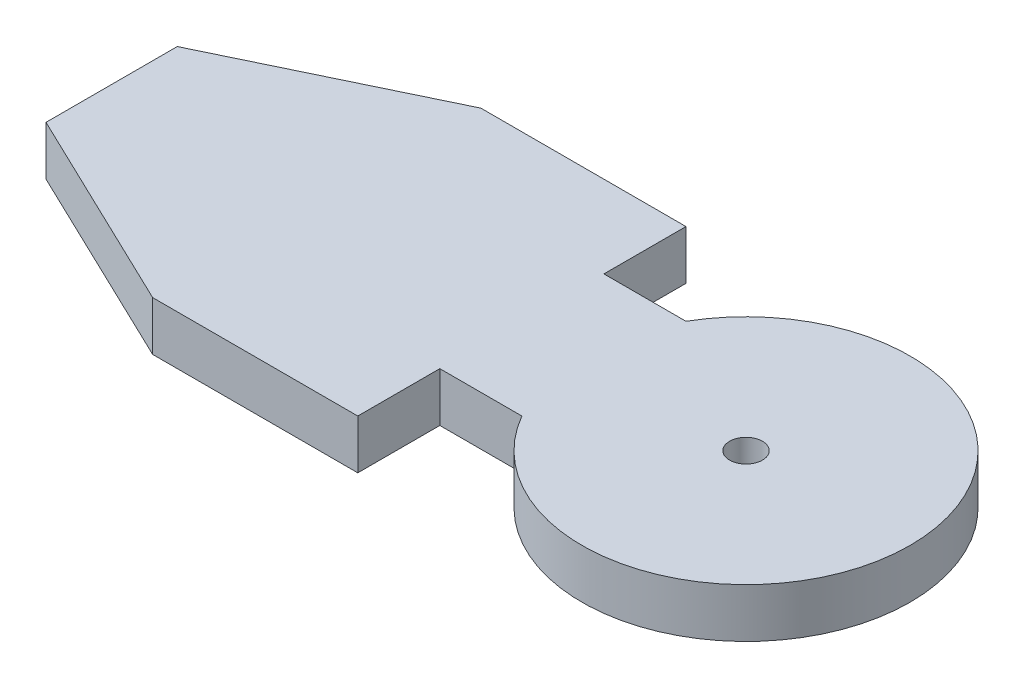
ISO-10303-21;
HEADER;
FILE_DESCRIPTION(('STEP AP214'),'2;1');
FILE_NAME('part.step','',(''),(''),'','','');
FILE_SCHEMA(('AUTOMOTIVE_DESIGN { 1 0 10303 214 1 1 1 1 }'));
ENDSEC;
DATA;
#1=APPLICATION_CONTEXT('core data for automotive mechanical design processes');
#2=APPLICATION_PROTOCOL_DEFINITION('international standard','automotive_design',2000,#1);
#3=PRODUCT_CONTEXT('',#1,'mechanical');
#4=PRODUCT('Part','Part','',(#3));
#5=PRODUCT_RELATED_PRODUCT_CATEGORY('part','',(#4));
#6=PRODUCT_DEFINITION_FORMATION('','',#4);
#7=PRODUCT_DEFINITION_CONTEXT('part definition',#1,'design');
#8=PRODUCT_DEFINITION('design','',#6,#7);
#9=PRODUCT_DEFINITION_SHAPE('','',#8);
#10=(LENGTH_UNIT() NAMED_UNIT(*) SI_UNIT(.MILLI.,.METRE.));
#11=(NAMED_UNIT(*) PLANE_ANGLE_UNIT() SI_UNIT($,.RADIAN.));
#12=(NAMED_UNIT(*) SI_UNIT($,.STERADIAN.) SOLID_ANGLE_UNIT());
#13=UNCERTAINTY_MEASURE_WITH_UNIT(LENGTH_MEASURE(1.E-05),#10,'distance_accuracy_value','');
#14=(GEOMETRIC_REPRESENTATION_CONTEXT(3) GLOBAL_UNCERTAINTY_ASSIGNED_CONTEXT((#13)) GLOBAL_UNIT_ASSIGNED_CONTEXT((#10,
#11,#12)) REPRESENTATION_CONTEXT('',''));
#15=CARTESIAN_POINT('',(0.,0.,0.));
#16=DIRECTION('',(0.,0.,1.));
#17=DIRECTION('',(1.,0.,0.));
#18=AXIS2_PLACEMENT_3D('',#15,#16,#17);
#19=CARTESIAN_POINT('',(0.,3.,0.));
#20=DIRECTION('',(-1.,0.,0.));
#21=DIRECTION('',(0.,0.,1.));
#22=AXIS2_PLACEMENT_3D('',#19,#20,#21);
#23=PLANE('',#22);
#24=DIRECTION('',(0.,0.,-1.));
#25=VECTOR('',#24,1.);
#26=CARTESIAN_POINT('',(0.,0.,0.));
#27=LINE('',#26,#25);
#28=CARTESIAN_POINT('',(0.,0.,0.));
#29=VERTEX_POINT('',#28);
#30=CARTESIAN_POINT('',(0.,0.,-5.));
#31=VERTEX_POINT('',#30);
#32=EDGE_CURVE('E142',#29,#31,#27,.T.);
#33=ORIENTED_EDGE('',*,*,#32,.T.);
#34=DIRECTION('',(0.,-1.,0.));
#35=VECTOR('',#34,1.);
#36=CARTESIAN_POINT('',(0.,3.,-5.));
#37=LINE('',#36,#35);
#38=CARTESIAN_POINT('',(0.,3.,-5.));
#39=VERTEX_POINT('',#38);
#40=EDGE_CURVE('E11',#39,#31,#37,.T.);
#41=ORIENTED_EDGE('',*,*,#40,.F.);
#42=DIRECTION('',(0.,0.,-1.));
#43=VECTOR('',#42,1.);
#44=CARTESIAN_POINT('',(0.,3.,0.));
#45=LINE('',#44,#43);
#46=CARTESIAN_POINT('',(0.,3.,0.));
#47=VERTEX_POINT('',#46);
#48=EDGE_CURVE('E160',#47,#39,#45,.T.);
#49=ORIENTED_EDGE('',*,*,#48,.F.);
#50=DIRECTION('',(0.,-1.,0.));
#51=VECTOR('',#50,1.);
#52=CARTESIAN_POINT('',(0.,3.,0.));
#53=LINE('',#52,#51);
#54=EDGE_CURVE('E138',#47,#29,#53,.T.);
#55=ORIENTED_EDGE('',*,*,#54,.T.);
#56=EDGE_LOOP('',(#33,#41,#49,#55));
#57=FACE_BOUND('',#56,.T.);
#58=ADVANCED_FACE('F33',(#57),#23,.F.);
#59=CARTESIAN_POINT('',(0.,3.,-5.));
#60=DIRECTION('',(0.,0.,-1.));
#61=DIRECTION('',(-1.,0.,0.));
#62=AXIS2_PLACEMENT_3D('',#59,#60,#61);
#63=PLANE('',#62);
#64=DIRECTION('',(1.,0.,0.));
#65=VECTOR('',#64,1.);
#66=CARTESIAN_POINT('',(0.,0.,-5.));
#67=LINE('',#66,#65);
#68=CARTESIAN_POINT('',(5.,0.,-5.));
#69=VERTEX_POINT('',#68);
#70=EDGE_CURVE('E145',#31,#69,#67,.T.);
#71=ORIENTED_EDGE('',*,*,#70,.T.);
#72=DIRECTION('',(0.,-1.,0.));
#73=VECTOR('',#72,1.);
#74=CARTESIAN_POINT('',(5.,3.,-5.));
#75=LINE('',#74,#73);
#76=CARTESIAN_POINT('',(5.,3.,-5.));
#77=VERTEX_POINT('',#76);
#78=EDGE_CURVE('E42',#77,#69,#75,.T.);
#79=ORIENTED_EDGE('',*,*,#78,.F.);
#80=DIRECTION('',(1.,0.,0.));
#81=VECTOR('',#80,1.);
#82=CARTESIAN_POINT('',(0.,3.,-5.));
#83=LINE('',#82,#81);
#84=EDGE_CURVE('E99',#39,#77,#83,.T.);
#85=ORIENTED_EDGE('',*,*,#84,.F.);
#86=ORIENTED_EDGE('',*,*,#40,.T.);
#87=EDGE_LOOP('',(#71,#79,#85,#86));
#88=FACE_BOUND('',#87,.T.);
#89=ADVANCED_FACE('F229',(#88),#63,.F.);
#90=CARTESIAN_POINT('',(13.6602540378444,3.,-10.));
#91=DIRECTION('',(0.,-1.,0.));
#92=DIRECTION('',(0.,0.,-1.));
#93=AXIS2_PLACEMENT_3D('',#90,#91,#92);
#94=CYLINDRICAL_SURFACE('',#93,10.);
#95=CARTESIAN_POINT('',(13.6602540378444,0.,-10.));
#96=DIRECTION('',(0.,1.,0.));
#97=DIRECTION('',(0.,0.,-1.));
#98=AXIS2_PLACEMENT_3D('',#95,#96,#97);
#99=CIRCLE('',#98,10.);
#100=CARTESIAN_POINT('',(5.,0.,-15.));
#101=VERTEX_POINT('',#100);
#102=EDGE_CURVE('E147',#69,#101,#99,.T.);
#103=ORIENTED_EDGE('',*,*,#102,.T.);
#104=DIRECTION('',(0.,-1.,0.));
#105=VECTOR('',#104,1.);
#106=CARTESIAN_POINT('',(5.,3.,-15.));
#107=LINE('',#106,#105);
#108=CARTESIAN_POINT('',(5.,3.,-15.));
#109=VERTEX_POINT('',#108);
#110=EDGE_CURVE('E173',#109,#101,#107,.T.);
#111=ORIENTED_EDGE('',*,*,#110,.F.);
#112=CARTESIAN_POINT('',(13.6602540378444,3.,-10.));
#113=DIRECTION('',(0.,1.,0.));
#114=DIRECTION('',(0.,0.,-1.));
#115=AXIS2_PLACEMENT_3D('',#112,#113,#114);
#116=CIRCLE('',#115,10.);
#117=EDGE_CURVE('E182',#77,#109,#116,.T.);
#118=ORIENTED_EDGE('',*,*,#117,.F.);
#119=ORIENTED_EDGE('',*,*,#78,.T.);
#120=EDGE_LOOP('',(#103,#111,#118,#119));
#121=FACE_BOUND('',#120,.T.);
#122=ADVANCED_FACE('F180',(#121),#94,.T.);
#123=CARTESIAN_POINT('',(0.,3.,-15.));
#124=DIRECTION('',(0.,0.,1.));
#125=DIRECTION('',(1.,0.,0.));
#126=AXIS2_PLACEMENT_3D('',#123,#124,#125);
#127=PLANE('',#126);
#128=DIRECTION('',(-1.,0.,0.));
#129=VECTOR('',#128,1.);
#130=CARTESIAN_POINT('',(0.,0.,-15.));
#131=LINE('',#130,#129);
#132=CARTESIAN_POINT('',(0.,0.,-15.));
#133=VERTEX_POINT('',#132);
#134=EDGE_CURVE('E149',#101,#133,#131,.T.);
#135=ORIENTED_EDGE('',*,*,#134,.T.);
#136=DIRECTION('',(0.,-1.,0.));
#137=VECTOR('',#136,1.);
#138=CARTESIAN_POINT('',(0.,3.,-15.));
#139=LINE('',#138,#137);
#140=CARTESIAN_POINT('',(0.,3.,-15.));
#141=VERTEX_POINT('',#140);
#142=EDGE_CURVE('E170',#141,#133,#139,.T.);
#143=ORIENTED_EDGE('',*,*,#142,.F.);
#144=DIRECTION('',(-1.,0.,0.));
#145=VECTOR('',#144,1.);
#146=CARTESIAN_POINT('',(0.,3.,-15.));
#147=LINE('',#146,#145);
#148=EDGE_CURVE('E200',#109,#141,#147,.T.);
#149=ORIENTED_EDGE('',*,*,#148,.F.);
#150=ORIENTED_EDGE('',*,*,#110,.T.);
#151=EDGE_LOOP('',(#135,#143,#149,#150));
#152=FACE_BOUND('',#151,.T.);
#153=ADVANCED_FACE('F191',(#152),#127,.F.);
#154=CARTESIAN_POINT('',(0.,3.,-15.));
#155=DIRECTION('',(-1.,0.,0.));
#156=DIRECTION('',(0.,0.,1.));
#157=AXIS2_PLACEMENT_3D('',#154,#155,#156);
#158=PLANE('',#157);
#159=DIRECTION('',(0.,0.,-1.));
#160=VECTOR('',#159,1.);
#161=CARTESIAN_POINT('',(0.,0.,-15.));
#162=LINE('',#161,#160);
#163=CARTESIAN_POINT('',(0.,0.,-20.));
#164=VERTEX_POINT('',#163);
#165=EDGE_CURVE('E151',#133,#164,#162,.T.);
#166=ORIENTED_EDGE('',*,*,#165,.T.);
#167=DIRECTION('',(0.,-1.,0.));
#168=VECTOR('',#167,1.);
#169=CARTESIAN_POINT('',(0.,3.,-20.));
#170=LINE('',#169,#168);
#171=CARTESIAN_POINT('',(0.,3.,-20.));
#172=VERTEX_POINT('',#171);
#173=EDGE_CURVE('E167',#172,#164,#170,.T.);
#174=ORIENTED_EDGE('',*,*,#173,.F.);
#175=DIRECTION('',(0.,0.,-1.));
#176=VECTOR('',#175,1.);
#177=CARTESIAN_POINT('',(0.,3.,-15.));
#178=LINE('',#177,#176);
#179=EDGE_CURVE('E197',#141,#172,#178,.T.);
#180=ORIENTED_EDGE('',*,*,#179,.F.);
#181=ORIENTED_EDGE('',*,*,#142,.T.);
#182=EDGE_LOOP('',(#166,#174,#180,#181));
#183=FACE_BOUND('',#182,.T.);
#184=ADVANCED_FACE('F195',(#183),#158,.F.);
#185=CARTESIAN_POINT('',(0.,3.,-20.));
#186=DIRECTION('',(0.,0.,1.));
#187=DIRECTION('',(1.,0.,0.));
#188=AXIS2_PLACEMENT_3D('',#185,#186,#187);
#189=PLANE('',#188);
#190=DIRECTION('',(-1.,0.,0.));
#191=VECTOR('',#190,1.);
#192=CARTESIAN_POINT('',(0.,0.,-20.));
#193=LINE('',#192,#191);
#194=CARTESIAN_POINT('',(-12.5,0.,-20.));
#195=VERTEX_POINT('',#194);
#196=EDGE_CURVE('E153',#164,#195,#193,.T.);
#197=ORIENTED_EDGE('',*,*,#196,.T.);
#198=DIRECTION('',(0.,-1.,0.));
#199=VECTOR('',#198,1.);
#200=CARTESIAN_POINT('',(-12.5,3.,-20.));
#201=LINE('',#200,#199);
#202=CARTESIAN_POINT('',(-12.5,3.,-20.));
#203=VERTEX_POINT('',#202);
#204=EDGE_CURVE('E164',#203,#195,#201,.T.);
#205=ORIENTED_EDGE('',*,*,#204,.F.);
#206=DIRECTION('',(-1.,0.,0.));
#207=VECTOR('',#206,1.);
#208=CARTESIAN_POINT('',(0.,3.,-20.));
#209=LINE('',#208,#207);
#210=EDGE_CURVE('E199',#172,#203,#209,.T.);
#211=ORIENTED_EDGE('',*,*,#210,.F.);
#212=ORIENTED_EDGE('',*,*,#173,.T.);
#213=EDGE_LOOP('',(#197,#205,#211,#212));
#214=FACE_BOUND('',#213,.T.);
#215=ADVANCED_FACE('F241',(#214),#189,.F.);
#216=CARTESIAN_POINT('',(-12.5,3.,-20.));
#217=DIRECTION('',(0.432731067584771,0.,0.901523057468273));
#218=DIRECTION('',(0.901523057468274,0.,-0.432731067584771));
#219=AXIS2_PLACEMENT_3D('',#216,#217,#218);
#220=PLANE('',#219);
#221=DIRECTION('',(-0.901523057468274,0.,0.432731067584771));
#222=VECTOR('',#221,1.);
#223=CARTESIAN_POINT('',(-12.5,0.,-20.));
#224=LINE('',#223,#222);
#225=CARTESIAN_POINT('',(-25.,0.,-14.));
#226=VERTEX_POINT('',#225);
#227=EDGE_CURVE('E155',#195,#226,#224,.T.);
#228=ORIENTED_EDGE('',*,*,#227,.T.);
#229=DIRECTION('',(0.,-1.,0.));
#230=VECTOR('',#229,1.);
#231=CARTESIAN_POINT('',(-25.,3.,-14.));
#232=LINE('',#231,#230);
#233=CARTESIAN_POINT('',(-25.,3.,-14.));
#234=VERTEX_POINT('',#233);
#235=EDGE_CURVE('E133',#234,#226,#232,.T.);
#236=ORIENTED_EDGE('',*,*,#235,.F.);
#237=DIRECTION('',(-0.901523057468274,0.,0.432731067584771));
#238=VECTOR('',#237,1.);
#239=CARTESIAN_POINT('',(-12.5,3.,-20.));
#240=LINE('',#239,#238);
#241=EDGE_CURVE('E124',#203,#234,#240,.T.);
#242=ORIENTED_EDGE('',*,*,#241,.F.);
#243=ORIENTED_EDGE('',*,*,#204,.T.);
#244=EDGE_LOOP('',(#228,#236,#242,#243));
#245=FACE_BOUND('',#244,.T.);
#246=ADVANCED_FACE('F238',(#245),#220,.F.);
#247=CARTESIAN_POINT('',(-25.,3.,-6.));
#248=DIRECTION('',(1.,0.,0.));
#249=DIRECTION('',(0.,0.,-1.));
#250=AXIS2_PLACEMENT_3D('',#247,#248,#249);
#251=PLANE('',#250);
#252=DIRECTION('',(0.,0.,1.));
#253=VECTOR('',#252,1.);
#254=CARTESIAN_POINT('',(-25.,0.,-6.));
#255=LINE('',#254,#253);
#256=CARTESIAN_POINT('',(-25.,0.,-6.));
#257=VERTEX_POINT('',#256);
#258=EDGE_CURVE('E132',#226,#257,#255,.T.);
#259=ORIENTED_EDGE('',*,*,#258,.T.);
#260=DIRECTION('',(0.,-1.,0.));
#261=VECTOR('',#260,1.);
#262=CARTESIAN_POINT('',(-25.,3.,-6.));
#263=LINE('',#262,#261);
#264=CARTESIAN_POINT('',(-25.,3.,-6.));
#265=VERTEX_POINT('',#264);
#266=EDGE_CURVE('E129',#265,#257,#263,.T.);
#267=ORIENTED_EDGE('',*,*,#266,.F.);
#268=DIRECTION('',(0.,0.,1.));
#269=VECTOR('',#268,1.);
#270=CARTESIAN_POINT('',(-25.,3.,-6.));
#271=LINE('',#270,#269);
#272=EDGE_CURVE('E118',#234,#265,#271,.T.);
#273=ORIENTED_EDGE('',*,*,#272,.F.);
#274=ORIENTED_EDGE('',*,*,#235,.T.);
#275=EDGE_LOOP('',(#259,#267,#273,#274));
#276=FACE_BOUND('',#275,.T.);
#277=ADVANCED_FACE('F130',(#276),#251,.F.);
#278=CARTESIAN_POINT('',(-12.5,3.,0.));
#279=DIRECTION('',(0.432731067584771,0.,-0.901523057468274));
#280=DIRECTION('',(-0.901523057468274,0.,-0.432731067584771));
#281=AXIS2_PLACEMENT_3D('',#278,#279,#280);
#282=PLANE('',#281);
#283=DIRECTION('',(0.901523057468274,0.,0.432731067584771));
#284=VECTOR('',#283,1.);
#285=CARTESIAN_POINT('',(-12.5,0.,0.));
#286=LINE('',#285,#284);
#287=CARTESIAN_POINT('',(-12.5,0.,0.));
#288=VERTEX_POINT('',#287);
#289=EDGE_CURVE('E85',#257,#288,#286,.T.);
#290=ORIENTED_EDGE('',*,*,#289,.T.);
#291=DIRECTION('',(0.,-1.,0.));
#292=VECTOR('',#291,1.);
#293=CARTESIAN_POINT('',(-12.5,3.,0.));
#294=LINE('',#293,#292);
#295=CARTESIAN_POINT('',(-12.5,3.,0.));
#296=VERTEX_POINT('',#295);
#297=EDGE_CURVE('E134',#296,#288,#294,.T.);
#298=ORIENTED_EDGE('',*,*,#297,.F.);
#299=DIRECTION('',(0.901523057468274,0.,0.432731067584771));
#300=VECTOR('',#299,1.);
#301=CARTESIAN_POINT('',(-12.5,3.,0.));
#302=LINE('',#301,#300);
#303=EDGE_CURVE('E122',#265,#296,#302,.T.);
#304=ORIENTED_EDGE('',*,*,#303,.F.);
#305=ORIENTED_EDGE('',*,*,#266,.T.);
#306=EDGE_LOOP('',(#290,#298,#304,#305));
#307=FACE_BOUND('',#306,.T.);
#308=ADVANCED_FACE('F136',(#307),#282,.F.);
#309=CARTESIAN_POINT('',(0.,3.,0.));
#310=DIRECTION('',(0.,0.,-1.));
#311=DIRECTION('',(-1.,0.,0.));
#312=AXIS2_PLACEMENT_3D('',#309,#310,#311);
#313=PLANE('',#312);
#314=DIRECTION('',(1.,0.,0.));
#315=VECTOR('',#314,1.);
#316=CARTESIAN_POINT('',(0.,0.,0.));
#317=LINE('',#316,#315);
#318=EDGE_CURVE('E91',#288,#29,#317,.T.);
#319=ORIENTED_EDGE('',*,*,#318,.T.);
#320=ORIENTED_EDGE('',*,*,#54,.F.);
#321=DIRECTION('',(1.,0.,0.));
#322=VECTOR('',#321,1.);
#323=CARTESIAN_POINT('',(0.,3.,0.));
#324=LINE('',#323,#322);
#325=EDGE_CURVE('E50',#296,#47,#324,.T.);
#326=ORIENTED_EDGE('',*,*,#325,.F.);
#327=ORIENTED_EDGE('',*,*,#297,.T.);
#328=EDGE_LOOP('',(#319,#320,#326,#327));
#329=FACE_BOUND('',#328,.T.);
#330=ADVANCED_FACE('F224',(#329),#313,.F.);
#331=CARTESIAN_POINT('',(13.6602540378444,3.,-10.));
#332=DIRECTION('',(0.,-1.,0.));
#333=DIRECTION('',(0.,0.,-1.));
#334=AXIS2_PLACEMENT_3D('',#331,#332,#333);
#335=PLANE('',#334);
#336=CARTESIAN_POINT('',(13.6602540378444,3.,-10.));
#337=DIRECTION('',(0.,1.,0.));
#338=DIRECTION('',(0.,0.,1.));
#339=AXIS2_PLACEMENT_3D('',#336,#337,#338);
#340=CIRCLE('',#339,1.);
#341=CARTESIAN_POINT('',(13.6602540378444,3.,-9.));
#342=VERTEX_POINT('',#341);
#343=EDGE_CURVE('E208',#342,#342,#340,.T.);
#344=ORIENTED_EDGE('',*,*,#343,.F.);
#345=EDGE_LOOP('',(#344));
#346=FACE_BOUND('',#345,.T.);
#347=ORIENTED_EDGE('',*,*,#48,.T.);
#348=ORIENTED_EDGE('',*,*,#84,.T.);
#349=ORIENTED_EDGE('',*,*,#117,.T.);
#350=ORIENTED_EDGE('',*,*,#148,.T.);
#351=ORIENTED_EDGE('',*,*,#179,.T.);
#352=ORIENTED_EDGE('',*,*,#210,.T.);
#353=ORIENTED_EDGE('',*,*,#241,.T.);
#354=ORIENTED_EDGE('',*,*,#272,.T.);
#355=ORIENTED_EDGE('',*,*,#303,.T.);
#356=ORIENTED_EDGE('',*,*,#325,.T.);
#357=EDGE_LOOP('',(#347,#348,#349,#350,#351,#352,#353,#354,#355,#356));
#358=FACE_BOUND('',#357,.T.);
#359=ADVANCED_FACE('F120',(#346,#358),#335,.F.);
#360=CARTESIAN_POINT('',(13.6602540378444,0.,-10.));
#361=DIRECTION('',(0.,-1.,0.));
#362=DIRECTION('',(0.,0.,-1.));
#363=AXIS2_PLACEMENT_3D('',#360,#361,#362);
#364=PLANE('',#363);
#365=CARTESIAN_POINT('',(13.6602540378444,0.,-10.));
#366=DIRECTION('',(0.,-1.,0.));
#367=DIRECTION('',(0.,0.,-1.));
#368=AXIS2_PLACEMENT_3D('',#365,#366,#367);
#369=CIRCLE('',#368,1.);
#370=CARTESIAN_POINT('',(13.6602540378444,0.,-11.));
#371=VERTEX_POINT('',#370);
#372=EDGE_CURVE('E36',#371,#371,#369,.T.);
#373=ORIENTED_EDGE('',*,*,#372,.F.);
#374=EDGE_LOOP('',(#373));
#375=FACE_BOUND('',#374,.T.);
#376=ORIENTED_EDGE('',*,*,#32,.F.);
#377=ORIENTED_EDGE('',*,*,#318,.F.);
#378=ORIENTED_EDGE('',*,*,#289,.F.);
#379=ORIENTED_EDGE('',*,*,#258,.F.);
#380=ORIENTED_EDGE('',*,*,#227,.F.);
#381=ORIENTED_EDGE('',*,*,#196,.F.);
#382=ORIENTED_EDGE('',*,*,#165,.F.);
#383=ORIENTED_EDGE('',*,*,#134,.F.);
#384=ORIENTED_EDGE('',*,*,#102,.F.);
#385=ORIENTED_EDGE('',*,*,#70,.F.);
#386=EDGE_LOOP('',(#376,#377,#378,#379,#380,#381,#382,#383,#384,#385));
#387=FACE_BOUND('',#386,.T.);
#388=ADVANCED_FACE('F186',(#375,#387),#364,.T.);
#389=CARTESIAN_POINT('',(13.6602540378444,-10.,-10.));
#390=DIRECTION('',(0.,1.,0.));
#391=DIRECTION('',(0.,0.,1.));
#392=AXIS2_PLACEMENT_3D('',#389,#390,#391);
#393=CYLINDRICAL_SURFACE('',#392,1.);
#394=ORIENTED_EDGE('',*,*,#372,.T.);
#395=EDGE_LOOP('',(#394));
#396=FACE_BOUND('',#395,.T.);
#397=ORIENTED_EDGE('',*,*,#343,.T.);
#398=EDGE_LOOP('',(#397));
#399=FACE_BOUND('',#398,.T.);
#400=ADVANCED_FACE('F215',(#396,#399),#393,.F.);
#401=CLOSED_SHELL('',(#58,#89,#122,#153,#184,#215,#246,#277,#308,#330,#359,#388,#400));
#402=MANIFOLD_SOLID_BREP('B2',#401);
#403=ADVANCED_BREP_SHAPE_REPRESENTATION('',(#18,#402),#14);
#404=SHAPE_DEFINITION_REPRESENTATION(#9,#403);
ENDSEC;
END-ISO-10303-21;
